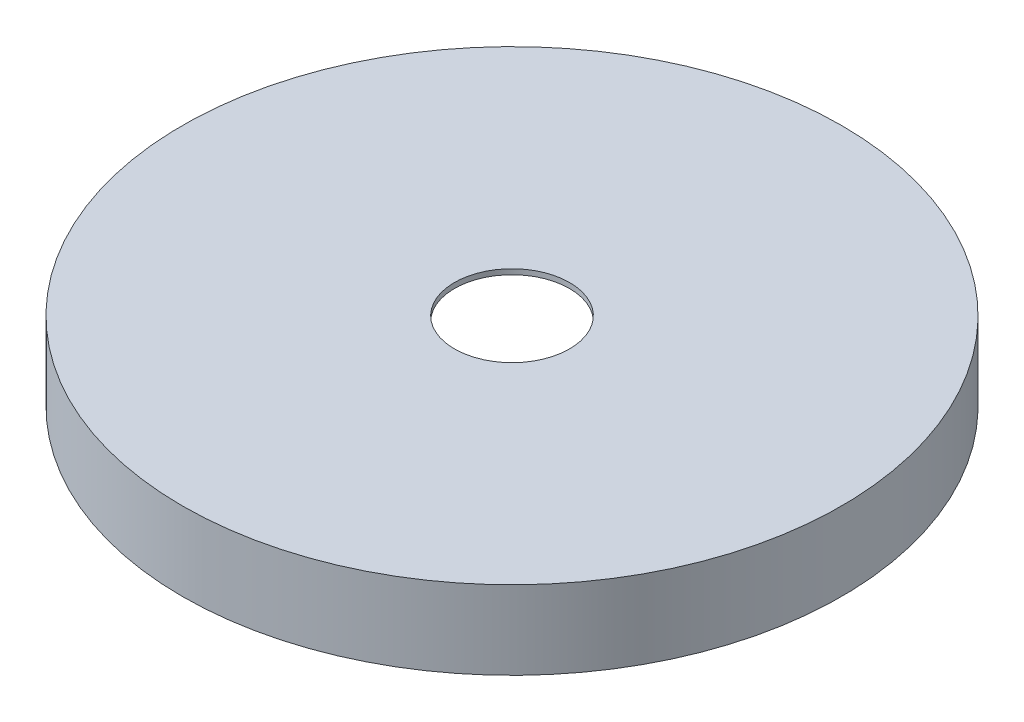
ISO-10303-21;
HEADER;
FILE_DESCRIPTION(('STEP AP214'),'2;1');
FILE_NAME('part.step','',(''),(''),'','','');
FILE_SCHEMA(('AUTOMOTIVE_DESIGN { 1 0 10303 214 1 1 1 1 }'));
ENDSEC;
DATA;
#1=APPLICATION_CONTEXT('core data for automotive mechanical design processes');
#2=APPLICATION_PROTOCOL_DEFINITION('international standard','automotive_design',2000,#1);
#3=PRODUCT_CONTEXT('',#1,'mechanical');
#4=PRODUCT('Part','Part','',(#3));
#5=PRODUCT_RELATED_PRODUCT_CATEGORY('part','',(#4));
#6=PRODUCT_DEFINITION_FORMATION('','',#4);
#7=PRODUCT_DEFINITION_CONTEXT('part definition',#1,'design');
#8=PRODUCT_DEFINITION('design','',#6,#7);
#9=PRODUCT_DEFINITION_SHAPE('','',#8);
#10=(LENGTH_UNIT() NAMED_UNIT(*) SI_UNIT(.MILLI.,.METRE.));
#11=(NAMED_UNIT(*) PLANE_ANGLE_UNIT() SI_UNIT($,.RADIAN.));
#12=(NAMED_UNIT(*) SI_UNIT($,.STERADIAN.) SOLID_ANGLE_UNIT());
#13=UNCERTAINTY_MEASURE_WITH_UNIT(LENGTH_MEASURE(1.E-05),#10,'distance_accuracy_value','');
#14=(GEOMETRIC_REPRESENTATION_CONTEXT(3) GLOBAL_UNCERTAINTY_ASSIGNED_CONTEXT((#13)) GLOBAL_UNIT_ASSIGNED_CONTEXT((#10,
#11,#12)) REPRESENTATION_CONTEXT('',''));
#15=CARTESIAN_POINT('',(0.,0.,0.));
#16=DIRECTION('',(0.,0.,1.));
#17=DIRECTION('',(1.,0.,0.));
#18=AXIS2_PLACEMENT_3D('',#15,#16,#17);
#19=CARTESIAN_POINT('',(0.,-2.54000000000002,0.));
#20=DIRECTION('',(0.,-1.,0.));
#21=DIRECTION('',(0.,0.,-1.));
#22=AXIS2_PLACEMENT_3D('',#19,#20,#21);
#23=CYLINDRICAL_SURFACE('',#22,157.48);
#24=CARTESIAN_POINT('',(0.,35.56,0.));
#25=DIRECTION('',(0.,-1.,0.));
#26=DIRECTION('',(0.,0.,-1.));
#27=AXIS2_PLACEMENT_3D('',#24,#25,#26);
#28=CIRCLE('',#27,157.48);
#29=CARTESIAN_POINT('',(0.,35.56,-157.48));
#30=VERTEX_POINT('',#29);
#31=EDGE_CURVE('E10',#30,#30,#28,.T.);
#32=ORIENTED_EDGE('',*,*,#31,.F.);
#33=EDGE_LOOP('',(#32));
#34=FACE_BOUND('',#33,.T.);
#35=CARTESIAN_POINT('',(0.,0.,0.));
#36=DIRECTION('',(0.,-1.,0.));
#37=DIRECTION('',(0.,0.,-1.));
#38=AXIS2_PLACEMENT_3D('',#35,#36,#37);
#39=CIRCLE('',#38,157.48);
#40=CARTESIAN_POINT('',(0.,0.,-157.48));
#41=VERTEX_POINT('',#40);
#42=EDGE_CURVE('E53',#41,#41,#39,.T.);
#43=ORIENTED_EDGE('',*,*,#42,.T.);
#44=EDGE_LOOP('',(#43));
#45=FACE_BOUND('',#44,.T.);
#46=ADVANCED_FACE('F31',(#34,#45),#23,.F.);
#47=CARTESIAN_POINT('',(-27.94,35.56,0.));
#48=DIRECTION('',(0.,1.,0.));
#49=DIRECTION('',(0.,0.,1.));
#50=AXIS2_PLACEMENT_3D('',#47,#48,#49);
#51=PLANE('',#50);
#52=CARTESIAN_POINT('',(0.,35.56,0.));
#53=DIRECTION('',(0.,-1.,0.));
#54=DIRECTION('',(0.,0.,-1.));
#55=AXIS2_PLACEMENT_3D('',#52,#53,#54);
#56=CIRCLE('',#55,27.94);
#57=CARTESIAN_POINT('',(0.,35.56,-27.94));
#58=VERTEX_POINT('',#57);
#59=EDGE_CURVE('E37',#58,#58,#56,.T.);
#60=ORIENTED_EDGE('',*,*,#59,.F.);
#61=EDGE_LOOP('',(#60));
#62=FACE_BOUND('',#61,.T.);
#63=ORIENTED_EDGE('',*,*,#31,.T.);
#64=EDGE_LOOP('',(#63));
#65=FACE_BOUND('',#64,.T.);
#66=ADVANCED_FACE('F78',(#62,#65),#51,.F.);
#67=CARTESIAN_POINT('',(0.,-2.54000000000002,0.));
#68=DIRECTION('',(0.,-1.,0.));
#69=DIRECTION('',(0.,0.,-1.));
#70=AXIS2_PLACEMENT_3D('',#67,#68,#69);
#71=CYLINDRICAL_SURFACE('',#70,27.94);
#72=CARTESIAN_POINT('',(0.,38.1,0.));
#73=DIRECTION('',(0.,-1.,0.));
#74=DIRECTION('',(0.,0.,-1.));
#75=AXIS2_PLACEMENT_3D('',#72,#73,#74);
#76=CIRCLE('',#75,27.94);
#77=CARTESIAN_POINT('',(0.,38.1,-27.94));
#78=VERTEX_POINT('',#77);
#79=EDGE_CURVE('E41',#78,#78,#76,.T.);
#80=ORIENTED_EDGE('',*,*,#79,.F.);
#81=EDGE_LOOP('',(#80));
#82=FACE_BOUND('',#81,.T.);
#83=ORIENTED_EDGE('',*,*,#59,.T.);
#84=EDGE_LOOP('',(#83));
#85=FACE_BOUND('',#84,.T.);
#86=ADVANCED_FACE('F73',(#82,#85),#71,.F.);
#87=CARTESIAN_POINT('',(-160.02,38.1,0.));
#88=DIRECTION('',(0.,-1.,0.));
#89=DIRECTION('',(0.,0.,-1.));
#90=AXIS2_PLACEMENT_3D('',#87,#88,#89);
#91=PLANE('',#90);
#92=CARTESIAN_POINT('',(0.,38.1,0.));
#93=DIRECTION('',(0.,-1.,0.));
#94=DIRECTION('',(0.,0.,-1.));
#95=AXIS2_PLACEMENT_3D('',#92,#93,#94);
#96=CIRCLE('',#95,160.02);
#97=CARTESIAN_POINT('',(0.,38.1,-160.02));
#98=VERTEX_POINT('',#97);
#99=EDGE_CURVE('E45',#98,#98,#96,.T.);
#100=ORIENTED_EDGE('',*,*,#99,.F.);
#101=EDGE_LOOP('',(#100));
#102=FACE_BOUND('',#101,.T.);
#103=ORIENTED_EDGE('',*,*,#79,.T.);
#104=EDGE_LOOP('',(#103));
#105=FACE_BOUND('',#104,.T.);
#106=ADVANCED_FACE('F67',(#102,#105),#91,.F.);
#107=CARTESIAN_POINT('',(0.,-2.54000000000002,0.));
#108=DIRECTION('',(0.,-1.,0.));
#109=DIRECTION('',(0.,0.,-1.));
#110=AXIS2_PLACEMENT_3D('',#107,#108,#109);
#111=CYLINDRICAL_SURFACE('',#110,160.02);
#112=CARTESIAN_POINT('',(0.,0.,0.));
#113=DIRECTION('',(0.,-1.,0.));
#114=DIRECTION('',(0.,0.,-1.));
#115=AXIS2_PLACEMENT_3D('',#112,#113,#114);
#116=CIRCLE('',#115,160.02);
#117=CARTESIAN_POINT('',(0.,0.,-160.02));
#118=VERTEX_POINT('',#117);
#119=EDGE_CURVE('E50',#118,#118,#116,.T.);
#120=ORIENTED_EDGE('',*,*,#119,.F.);
#121=EDGE_LOOP('',(#120));
#122=FACE_BOUND('',#121,.T.);
#123=ORIENTED_EDGE('',*,*,#99,.T.);
#124=EDGE_LOOP('',(#123));
#125=FACE_BOUND('',#124,.T.);
#126=ADVANCED_FACE('F61',(#122,#125),#111,.T.);
#127=CARTESIAN_POINT('',(-157.48,0.,0.));
#128=DIRECTION('',(0.,1.,0.));
#129=DIRECTION('',(0.,0.,1.));
#130=AXIS2_PLACEMENT_3D('',#127,#128,#129);
#131=PLANE('',#130);
#132=ORIENTED_EDGE('',*,*,#42,.F.);
#133=EDGE_LOOP('',(#132));
#134=FACE_BOUND('',#133,.T.);
#135=ORIENTED_EDGE('',*,*,#119,.T.);
#136=EDGE_LOOP('',(#135));
#137=FACE_BOUND('',#136,.T.);
#138=ADVANCED_FACE('F58',(#134,#137),#131,.F.);
#139=CLOSED_SHELL('',(#46,#66,#86,#106,#126,#138));
#140=MANIFOLD_SOLID_BREP('B2',#139);
#141=ADVANCED_BREP_SHAPE_REPRESENTATION('',(#18,#140),#14);
#142=SHAPE_DEFINITION_REPRESENTATION(#9,#141);
ENDSEC;
END-ISO-10303-21;
